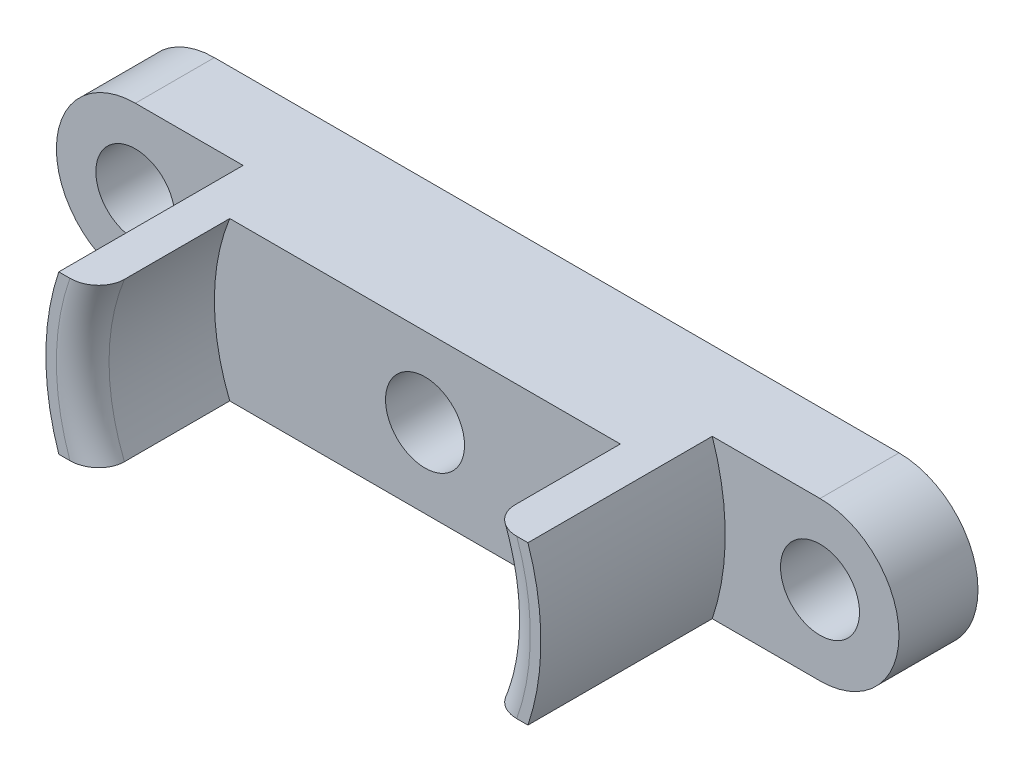
ISO-10303-21;
HEADER;
FILE_DESCRIPTION(('STEP AP214'),'2;1');
FILE_NAME('part.step','',(''),(''),'','','');
FILE_SCHEMA(('AUTOMOTIVE_DESIGN { 1 0 10303 214 1 1 1 1 }'));
ENDSEC;
DATA;
#1=APPLICATION_CONTEXT('core data for automotive mechanical design processes');
#2=APPLICATION_PROTOCOL_DEFINITION('international standard','automotive_design',2000,#1);
#3=PRODUCT_CONTEXT('',#1,'mechanical');
#4=PRODUCT('Part','Part','',(#3));
#5=PRODUCT_RELATED_PRODUCT_CATEGORY('part','',(#4));
#6=PRODUCT_DEFINITION_FORMATION('','',#4);
#7=PRODUCT_DEFINITION_CONTEXT('part definition',#1,'design');
#8=PRODUCT_DEFINITION('design','',#6,#7);
#9=PRODUCT_DEFINITION_SHAPE('','',#8);
#10=(LENGTH_UNIT() NAMED_UNIT(*) SI_UNIT(.MILLI.,.METRE.));
#11=(NAMED_UNIT(*) PLANE_ANGLE_UNIT() SI_UNIT($,.RADIAN.));
#12=(NAMED_UNIT(*) SI_UNIT($,.STERADIAN.) SOLID_ANGLE_UNIT());
#13=UNCERTAINTY_MEASURE_WITH_UNIT(LENGTH_MEASURE(1.E-05),#10,'distance_accuracy_value','');
#14=(GEOMETRIC_REPRESENTATION_CONTEXT(3) GLOBAL_UNCERTAINTY_ASSIGNED_CONTEXT((#13)) GLOBAL_UNIT_ASSIGNED_CONTEXT((#10,
#11,#12)) REPRESENTATION_CONTEXT('',''));
#15=CARTESIAN_POINT('',(0.,0.,0.));
#16=DIRECTION('',(0.,0.,1.));
#17=DIRECTION('',(1.,0.,0.));
#18=AXIS2_PLACEMENT_3D('',#15,#16,#17);
#19=CARTESIAN_POINT('',(9.4,0.,0.));
#20=DIRECTION('',(0.,0.,-1.));
#21=DIRECTION('',(-1.,0.,0.));
#22=AXIS2_PLACEMENT_3D('',#19,#20,#21);
#23=PLANE('',#22);
#24=CARTESIAN_POINT('',(0.,0.,0.));
#25=DIRECTION('',(0.,0.,1.));
#26=DIRECTION('',(1.,0.,0.));
#27=AXIS2_PLACEMENT_3D('',#24,#25,#26);
#28=CIRCLE('',#27,1.5);
#29=CARTESIAN_POINT('',(1.5,0.,0.));
#30=VERTEX_POINT('',#29);
#31=EDGE_CURVE('E193',#30,#30,#28,.T.);
#32=ORIENTED_EDGE('',*,*,#31,.F.);
#33=EDGE_LOOP('',(#32));
#34=FACE_BOUND('',#33,.T.);
#35=DIRECTION('',(1.,0.,0.));
#36=VECTOR('',#35,1.);
#37=CARTESIAN_POINT('',(9.4,-3.,0.));
#38=LINE('',#37,#36);
#39=CARTESIAN_POINT('',(-7.41619848709566,-3.,0.));
#40=VERTEX_POINT('',#39);
#41=CARTESIAN_POINT('',(7.41619848709566,-3.,0.));
#42=VERTEX_POINT('',#41);
#43=EDGE_CURVE('E246',#40,#42,#38,.T.);
#44=ORIENTED_EDGE('',*,*,#43,.T.);
#45=CARTESIAN_POINT('',(0.,0.,0.));
#46=DIRECTION('',(0.,0.,1.));
#47=DIRECTION('',(1.,0.,0.));
#48=AXIS2_PLACEMENT_3D('',#45,#46,#47);
#49=CIRCLE('',#48,8.);
#50=CARTESIAN_POINT('',(7.41619848709566,3.,0.));
#51=VERTEX_POINT('',#50);
#52=EDGE_CURVE('E148',#42,#51,#49,.T.);
#53=ORIENTED_EDGE('',*,*,#52,.T.);
#54=DIRECTION('',(1.,0.,0.));
#55=VECTOR('',#54,1.);
#56=CARTESIAN_POINT('',(9.4,3.,0.));
#57=LINE('',#56,#55);
#58=CARTESIAN_POINT('',(-7.41619848709566,3.,0.));
#59=VERTEX_POINT('',#58);
#60=EDGE_CURVE('E243',#59,#51,#57,.T.);
#61=ORIENTED_EDGE('',*,*,#60,.F.);
#62=CARTESIAN_POINT('',(0.,0.,0.));
#63=DIRECTION('',(0.,0.,1.));
#64=DIRECTION('',(1.,0.,0.));
#65=AXIS2_PLACEMENT_3D('',#62,#63,#64);
#66=CIRCLE('',#65,8.);
#67=EDGE_CURVE('E174',#59,#40,#66,.T.);
#68=ORIENTED_EDGE('',*,*,#67,.T.);
#69=EDGE_LOOP('',(#44,#53,#61,#68));
#70=FACE_BOUND('',#69,.T.);
#71=ADVANCED_FACE('F39',(#34,#70),#23,.F.);
#72=CARTESIAN_POINT('',(0.,0.,0.));
#73=DIRECTION('',(0.,0.,-1.));
#74=DIRECTION('',(-1.,0.,0.));
#75=AXIS2_PLACEMENT_3D('',#72,#73,#74);
#76=CYLINDRICAL_SURFACE('',#75,9.4);
#77=CARTESIAN_POINT('',(0.,0.,-2.));
#78=DIRECTION('',(0.,0.,-1.));
#79=DIRECTION('',(-1.,0.,0.));
#80=AXIS2_PLACEMENT_3D('',#77,#78,#79);
#81=CIRCLE('',#80,9.4);
#82=CARTESIAN_POINT('',(-8.90842298052804,-3.,-2.));
#83=VERTEX_POINT('',#82);
#84=CARTESIAN_POINT('',(-8.90842298052804,3.,-2.));
#85=VERTEX_POINT('',#84);
#86=EDGE_CURVE('E239',#83,#85,#81,.T.);
#87=ORIENTED_EDGE('',*,*,#86,.F.);
#88=DIRECTION('',(0.,0.,-1.));
#89=VECTOR('',#88,1.);
#90=CARTESIAN_POINT('',(-8.90842298052804,-3.,0.));
#91=LINE('',#90,#89);
#92=CARTESIAN_POINT('',(-8.90842298052804,-3.,5.));
#93=VERTEX_POINT('',#92);
#94=EDGE_CURVE('E227',#83,#93,#91,.F.);
#95=ORIENTED_EDGE('',*,*,#94,.T.);
#96=CARTESIAN_POINT('',(0.,0.,5.));
#97=DIRECTION('',(0.,0.,1.));
#98=DIRECTION('',(1.,0.,0.));
#99=AXIS2_PLACEMENT_3D('',#96,#97,#98);
#100=CIRCLE('',#99,9.4);
#101=CARTESIAN_POINT('',(-8.90842298052804,3.,5.));
#102=VERTEX_POINT('',#101);
#103=EDGE_CURVE('E177',#102,#93,#100,.T.);
#104=ORIENTED_EDGE('',*,*,#103,.F.);
#105=DIRECTION('',(0.,0.,-1.));
#106=VECTOR('',#105,1.);
#107=CARTESIAN_POINT('',(-8.90842298052804,3.,0.));
#108=LINE('',#107,#106);
#109=EDGE_CURVE('E211',#85,#102,#108,.F.);
#110=ORIENTED_EDGE('',*,*,#109,.F.);
#111=EDGE_LOOP('',(#87,#95,#104,#110));
#112=FACE_BOUND('',#111,.T.);
#113=ADVANCED_FACE('F314',(#112),#76,.T.);
#114=DIRECTION('',(0.,0.,-1.));
#115=VECTOR('',#114,1.);
#116=CARTESIAN_POINT('',(8.90842298052804,3.,0.));
#117=LINE('',#116,#115);
#118=CARTESIAN_POINT('',(8.90842298052804,3.,5.));
#119=VERTEX_POINT('',#118);
#120=CARTESIAN_POINT('',(8.90842298052804,3.,-2.));
#121=VERTEX_POINT('',#120);
#122=EDGE_CURVE('E163',#119,#121,#117,.T.);
#123=ORIENTED_EDGE('',*,*,#122,.F.);
#124=CARTESIAN_POINT('',(0.,0.,5.));
#125=DIRECTION('',(0.,0.,1.));
#126=DIRECTION('',(1.,0.,0.));
#127=AXIS2_PLACEMENT_3D('',#124,#125,#126);
#128=CIRCLE('',#127,9.4);
#129=CARTESIAN_POINT('',(8.90842298052804,-3.,5.));
#130=VERTEX_POINT('',#129);
#131=EDGE_CURVE('E145',#130,#119,#128,.T.);
#132=ORIENTED_EDGE('',*,*,#131,.F.);
#133=DIRECTION('',(0.,0.,-1.));
#134=VECTOR('',#133,1.);
#135=CARTESIAN_POINT('',(8.90842298052804,-3.,0.));
#136=LINE('',#135,#134);
#137=CARTESIAN_POINT('',(8.90842298052804,-3.,-2.));
#138=VERTEX_POINT('',#137);
#139=EDGE_CURVE('E151',#130,#138,#136,.T.);
#140=ORIENTED_EDGE('',*,*,#139,.T.);
#141=EDGE_CURVE('E242',#121,#138,#81,.T.);
#142=ORIENTED_EDGE('',*,*,#141,.F.);
#143=EDGE_LOOP('',(#123,#132,#140,#142));
#144=FACE_BOUND('',#143,.T.);
#145=ADVANCED_FACE('F162',(#144),#76,.T.);
#146=CARTESIAN_POINT('',(20.,0.,-2.));
#147=DIRECTION('',(0.,0.,-1.));
#148=DIRECTION('',(-1.,0.,0.));
#149=AXIS2_PLACEMENT_3D('',#146,#147,#148);
#150=PLANE('',#149);
#151=CARTESIAN_POINT('',(13.,0.,-2.));
#152=DIRECTION('',(0.,0.,-1.));
#153=DIRECTION('',(-1.,0.,0.));
#154=AXIS2_PLACEMENT_3D('',#151,#152,#153);
#155=CIRCLE('',#154,1.5);
#156=CARTESIAN_POINT('',(11.5,0.,-2.));
#157=VERTEX_POINT('',#156);
#158=EDGE_CURVE('E199',#157,#157,#155,.T.);
#159=ORIENTED_EDGE('',*,*,#158,.T.);
#160=EDGE_LOOP('',(#159));
#161=FACE_BOUND('',#160,.T.);
#162=ORIENTED_EDGE('',*,*,#141,.T.);
#163=DIRECTION('',(1.,0.,0.));
#164=VECTOR('',#163,1.);
#165=CARTESIAN_POINT('',(20.,-3.,-2.));
#166=LINE('',#165,#164);
#167=CARTESIAN_POINT('',(13.,-3.,-2.));
#168=VERTEX_POINT('',#167);
#169=EDGE_CURVE('E156',#138,#168,#166,.T.);
#170=ORIENTED_EDGE('',*,*,#169,.T.);
#171=CARTESIAN_POINT('',(13.,0.,-2.));
#172=DIRECTION('',(0.,0.,-1.));
#173=DIRECTION('',(-1.,0.,0.));
#174=AXIS2_PLACEMENT_3D('',#171,#172,#173);
#175=CIRCLE('',#174,3.);
#176=CARTESIAN_POINT('',(13.,3.,-2.));
#177=VERTEX_POINT('',#176);
#178=EDGE_CURVE('E249',#177,#168,#175,.T.);
#179=ORIENTED_EDGE('',*,*,#178,.F.);
#180=DIRECTION('',(1.,0.,0.));
#181=VECTOR('',#180,1.);
#182=CARTESIAN_POINT('',(20.,3.,-2.));
#183=LINE('',#182,#181);
#184=EDGE_CURVE('E223',#121,#177,#183,.T.);
#185=ORIENTED_EDGE('',*,*,#184,.F.);
#186=EDGE_LOOP('',(#162,#170,#179,#185));
#187=FACE_BOUND('',#186,.T.);
#188=ADVANCED_FACE('F308',(#161,#187),#150,.F.);
#189=CARTESIAN_POINT('',(-13.,0.,-2.));
#190=DIRECTION('',(0.,0.,-1.));
#191=DIRECTION('',(-1.,0.,0.));
#192=AXIS2_PLACEMENT_3D('',#189,#190,#191);
#193=CIRCLE('',#192,1.5);
#194=CARTESIAN_POINT('',(-14.5,0.,-2.));
#195=VERTEX_POINT('',#194);
#196=EDGE_CURVE('E204',#195,#195,#193,.T.);
#197=ORIENTED_EDGE('',*,*,#196,.T.);
#198=EDGE_LOOP('',(#197));
#199=FACE_BOUND('',#198,.T.);
#200=CARTESIAN_POINT('',(-13.,0.,-2.));
#201=DIRECTION('',(0.,0.,-1.));
#202=DIRECTION('',(-1.,0.,0.));
#203=AXIS2_PLACEMENT_3D('',#200,#201,#202);
#204=CIRCLE('',#203,3.);
#205=CARTESIAN_POINT('',(-13.,-3.,-2.));
#206=VERTEX_POINT('',#205);
#207=CARTESIAN_POINT('',(-13.,3.,-2.));
#208=VERTEX_POINT('',#207);
#209=EDGE_CURVE('E251',#206,#208,#204,.T.);
#210=ORIENTED_EDGE('',*,*,#209,.F.);
#211=EDGE_CURVE('E160',#206,#83,#166,.T.);
#212=ORIENTED_EDGE('',*,*,#211,.T.);
#213=ORIENTED_EDGE('',*,*,#86,.T.);
#214=EDGE_CURVE('E221',#208,#85,#183,.T.);
#215=ORIENTED_EDGE('',*,*,#214,.F.);
#216=EDGE_LOOP('',(#210,#212,#213,#215));
#217=FACE_BOUND('',#216,.T.);
#218=ADVANCED_FACE('F311',(#199,#217),#150,.F.);
#219=CARTESIAN_POINT('',(-13.,0.,-10.));
#220=DIRECTION('',(0.,0.,1.));
#221=DIRECTION('',(1.,0.,0.));
#222=AXIS2_PLACEMENT_3D('',#219,#220,#221);
#223=CYLINDRICAL_SURFACE('',#222,3.);
#224=CARTESIAN_POINT('',(-13.,0.,-5.));
#225=DIRECTION('',(0.,0.,1.));
#226=DIRECTION('',(1.,0.,0.));
#227=AXIS2_PLACEMENT_3D('',#224,#225,#226);
#228=CIRCLE('',#227,3.);
#229=CARTESIAN_POINT('',(-13.,3.,-5.));
#230=VERTEX_POINT('',#229);
#231=CARTESIAN_POINT('',(-13.,-3.,-5.));
#232=VERTEX_POINT('',#231);
#233=EDGE_CURVE('E237',#230,#232,#228,.T.);
#234=ORIENTED_EDGE('',*,*,#233,.T.);
#235=DIRECTION('',(0.,0.,1.));
#236=VECTOR('',#235,1.);
#237=CARTESIAN_POINT('',(-13.,-3.,-10.));
#238=LINE('',#237,#236);
#239=EDGE_CURVE('E208',#232,#206,#238,.T.);
#240=ORIENTED_EDGE('',*,*,#239,.T.);
#241=ORIENTED_EDGE('',*,*,#209,.T.);
#242=DIRECTION('',(0.,0.,1.));
#243=VECTOR('',#242,1.);
#244=CARTESIAN_POINT('',(-13.,3.,-10.));
#245=LINE('',#244,#243);
#246=EDGE_CURVE('E207',#230,#208,#245,.T.);
#247=ORIENTED_EDGE('',*,*,#246,.F.);
#248=EDGE_LOOP('',(#234,#240,#241,#247));
#249=FACE_BOUND('',#248,.T.);
#250=ADVANCED_FACE('F280',(#249),#223,.T.);
#251=CARTESIAN_POINT('',(13.,0.,-10.));
#252=DIRECTION('',(0.,0.,1.));
#253=DIRECTION('',(1.,0.,0.));
#254=AXIS2_PLACEMENT_3D('',#251,#252,#253);
#255=CYLINDRICAL_SURFACE('',#254,3.);
#256=CARTESIAN_POINT('',(13.,0.,-5.));
#257=DIRECTION('',(0.,0.,1.));
#258=DIRECTION('',(1.,0.,0.));
#259=AXIS2_PLACEMENT_3D('',#256,#257,#258);
#260=CIRCLE('',#259,3.);
#261=CARTESIAN_POINT('',(13.,-3.,-5.));
#262=VERTEX_POINT('',#261);
#263=CARTESIAN_POINT('',(13.,3.,-5.));
#264=VERTEX_POINT('',#263);
#265=EDGE_CURVE('E234',#262,#264,#260,.T.);
#266=ORIENTED_EDGE('',*,*,#265,.T.);
#267=DIRECTION('',(0.,0.,1.));
#268=VECTOR('',#267,1.);
#269=CARTESIAN_POINT('',(13.,3.,-10.));
#270=LINE('',#269,#268);
#271=EDGE_CURVE('E214',#264,#177,#270,.T.);
#272=ORIENTED_EDGE('',*,*,#271,.T.);
#273=ORIENTED_EDGE('',*,*,#178,.T.);
#274=DIRECTION('',(0.,0.,1.));
#275=VECTOR('',#274,1.);
#276=CARTESIAN_POINT('',(13.,-3.,-10.));
#277=LINE('',#276,#275);
#278=EDGE_CURVE('E212',#262,#168,#277,.T.);
#279=ORIENTED_EDGE('',*,*,#278,.F.);
#280=EDGE_LOOP('',(#266,#272,#273,#279));
#281=FACE_BOUND('',#280,.T.);
#282=ADVANCED_FACE('F274',(#281),#255,.T.);
#283=CARTESIAN_POINT('',(0.,-3.,-10.));
#284=DIRECTION('',(0.,1.,0.));
#285=DIRECTION('',(-1.,0.,0.));
#286=AXIS2_PLACEMENT_3D('',#283,#284,#285);
#287=PLANE('',#286);
#288=DIRECTION('',(0.,0.,-1.));
#289=VECTOR('',#288,1.);
#290=CARTESIAN_POINT('',(-7.41619848709566,-3.,5.));
#291=LINE('',#290,#289);
#292=CARTESIAN_POINT('',(-7.41619848709566,-3.,4.));
#293=VERTEX_POINT('',#292);
#294=EDGE_CURVE('E183',#293,#40,#291,.T.);
#295=ORIENTED_EDGE('',*,*,#294,.F.);
#296=CARTESIAN_POINT('',(-7.41619848709566,-3.,4.));
#297=CARTESIAN_POINT('',(-7.4161974516499,-3.,4.02671031925472));
#298=CARTESIAN_POINT('',(-7.41735370748078,-3.,4.05340720680812));
#299=CARTESIAN_POINT('',(-7.42195828462665,-3.,4.10659690853907));
#300=CARTESIAN_POINT('',(-7.42540611379944,-3.,4.13308976529908));
#301=CARTESIAN_POINT('',(-7.4391197375161,-3.,4.21181741639208));
#302=CARTESIAN_POINT('',(-7.45275605613087,-3.,4.26350321971868));
#303=CARTESIAN_POINT('',(-7.4884583472389,-3.,4.36381342367036));
#304=CARTESIAN_POINT('',(-7.51052161952716,-3.,4.41243879912516));
#305=CARTESIAN_POINT('',(-7.56225114660627,-3.,4.50547851711049));
#306=CARTESIAN_POINT('',(-7.59192080321964,-3.,4.54989096327469));
#307=CARTESIAN_POINT('',(-7.65893400910423,-3.,4.6348559352489));
#308=CARTESIAN_POINT('',(-7.6964958261191,-3.,4.67523586239732));
#309=CARTESIAN_POINT('',(-7.77747805679832,-3.,4.74961235501127));
#310=CARTESIAN_POINT('',(-7.82090018355841,-3.,4.78360704695797));
#311=CARTESIAN_POINT('',(-7.91552912228609,-3.,4.84667744181656));
#312=CARTESIAN_POINT('',(-7.96706490899262,-3.,4.8752594190202));
#313=CARTESIAN_POINT('',(-8.07401768747977,-3.,4.92389691310696));
#314=CARTESIAN_POINT('',(-8.12943533997931,-3.,4.94395097435576));
#315=CARTESIAN_POINT('',(-8.23476233559423,-3.,4.97296668075931));
#316=CARTESIAN_POINT('',(-8.28435629789409,-3.,4.9830884004965));
#317=CARTESIAN_POINT('',(-8.38439055372453,-3.,4.99660629151515));
#318=CARTESIAN_POINT('',(-8.43482974049444,-3.,5.00001065581628));
#319=CARTESIAN_POINT('',(-8.48528137423857,-3.,5.));
#320=B_SPLINE_CURVE_WITH_KNOTS('',3,(#296,#297,#298,#299,#300,#301,#302,#303,#304,#305,#306,
#307,#308,#309,#310,#311,#312,#313,#314,#315,#316,#317,#318,#319),.UNSPECIFIED.,.F.,.F.,(4,2,2,
2,2,2,2,2,2,2,2,4),(0.,0.0800795988703778,0.160142005264271,0.319669063502225,0.479145048138582,
0.638692480425243,0.803430892753028,0.968217566423583,1.144244987843,1.32030244342439,
1.47170555658374,1.62292389206545),.UNSPECIFIED.);
#321=CARTESIAN_POINT('',(-8.48528137423857,-3.,5.));
#322=VERTEX_POINT('',#321);
#323=EDGE_CURVE('E263',#293,#322,#320,.T.);
#324=ORIENTED_EDGE('',*,*,#323,.T.);
#325=DIRECTION('',(1.,0.,0.));
#326=VECTOR('',#325,1.);
#327=CARTESIAN_POINT('',(0.,-3.,5.));
#328=LINE('',#327,#326);
#329=EDGE_CURVE('E180',#93,#322,#328,.T.);
#330=ORIENTED_EDGE('',*,*,#329,.F.);
#331=ORIENTED_EDGE('',*,*,#94,.F.);
#332=ORIENTED_EDGE('',*,*,#211,.F.);
#333=ORIENTED_EDGE('',*,*,#239,.F.);
#334=DIRECTION('',(-1.,0.,0.));
#335=VECTOR('',#334,1.);
#336=CARTESIAN_POINT('',(0.,-3.,-5.));
#337=LINE('',#336,#335);
#338=EDGE_CURVE('E231',#262,#232,#337,.T.);
#339=ORIENTED_EDGE('',*,*,#338,.F.);
#340=ORIENTED_EDGE('',*,*,#278,.T.);
#341=ORIENTED_EDGE('',*,*,#169,.F.);
#342=ORIENTED_EDGE('',*,*,#139,.F.);
#343=DIRECTION('',(1.,0.,0.));
#344=VECTOR('',#343,1.);
#345=CARTESIAN_POINT('',(0.,-3.,5.));
#346=LINE('',#345,#344);
#347=CARTESIAN_POINT('',(8.48528137423857,-3.,5.));
#348=VERTEX_POINT('',#347);
#349=EDGE_CURVE('E141',#348,#130,#346,.T.);
#350=ORIENTED_EDGE('',*,*,#349,.F.);
#351=CARTESIAN_POINT('',(8.48528137423857,-3.,5.));
#352=CARTESIAN_POINT('',(8.42226393540121,-3.,5.0000319900897));
#353=CARTESIAN_POINT('',(8.35925227893192,-3.,4.99470639341083));
#354=CARTESIAN_POINT('',(8.23494281659764,-3.,4.97364389436913));
#355=CARTESIAN_POINT('',(8.17364638008231,-3.,4.95789890767096));
#356=CARTESIAN_POINT('',(8.05452747973125,-3.,4.91628651175392));
#357=CARTESIAN_POINT('',(7.99670770733442,-3.,4.89041137382055));
#358=CARTESIAN_POINT('',(7.88639312032773,-3.,4.8291071882532));
#359=CARTESIAN_POINT('',(7.83389563064259,-3.,4.79368297324682));
#360=CARTESIAN_POINT('',(7.73717380407074,-3.,4.71502801902589));
#361=CARTESIAN_POINT('',(7.69278168869515,-3.,4.67200415176985));
#362=CARTESIAN_POINT('',(7.61243799180938,-3.,4.57865017114228));
#363=CARTESIAN_POINT('',(7.57648578754844,-3.,4.52832059727638));
#364=CARTESIAN_POINT('',(7.51658187323216,-3.,4.42522415374338));
#365=CARTESIAN_POINT('',(7.49201234456019,-3.,4.3728158919755));
#366=CARTESIAN_POINT('',(7.45277650420531,-3.,4.26445470148666));
#367=CARTESIAN_POINT('',(7.43809309595684,-3.,4.20850807613736));
#368=CARTESIAN_POINT('',(7.42453409593175,-3.,4.12666659642371));
#369=CARTESIAN_POINT('',(7.42140952314321,-3.,4.10141676743156));
#370=CARTESIAN_POINT('',(7.41724337514938,-3.,4.05078258934528));
#371=CARTESIAN_POINT('',(7.41619879948655,-3.,4.02539848705991));
#372=CARTESIAN_POINT('',(7.41619848709566,-3.,4.));
#373=B_SPLINE_CURVE_WITH_KNOTS('',3,(#351,#352,#353,#354,#355,#356,#357,#358,#359,#360,#361,
#362,#363,#364,#365,#366,#367,#368,#369,#370,#371,#372),.UNSPECIFIED.,.F.,.F.,(4,2,2,2,2,2,2,2,
2,2,4),(0.,0.188823641078102,0.377793961207349,0.5669087365114,0.755927983104457,
0.9404284487611,1.12491529650832,1.29766847240514,1.47012212487818,1.54637780906175,
1.62252341223943),.UNSPECIFIED.);
#374=CARTESIAN_POINT('',(7.41619848709566,-3.,4.));
#375=VERTEX_POINT('',#374);
#376=EDGE_CURVE('E256',#348,#375,#373,.T.);
#377=ORIENTED_EDGE('',*,*,#376,.T.);
#378=DIRECTION('',(0.,0.,-1.));
#379=VECTOR('',#378,1.);
#380=CARTESIAN_POINT('',(7.41619848709566,-3.,5.));
#381=LINE('',#380,#379);
#382=EDGE_CURVE('E172',#375,#42,#381,.T.);
#383=ORIENTED_EDGE('',*,*,#382,.T.);
#384=ORIENTED_EDGE('',*,*,#43,.F.);
#385=EDGE_LOOP('',(#295,#324,#330,#331,#332,#333,#339,#340,#341,#342,#350,#377,#383,#384));
#386=FACE_BOUND('',#385,.T.);
#387=ADVANCED_FACE('F153',(#386),#287,.F.);
#388=CARTESIAN_POINT('',(0.,3.,-10.));
#389=DIRECTION('',(0.,1.,0.));
#390=DIRECTION('',(-1.,0.,0.));
#391=AXIS2_PLACEMENT_3D('',#388,#389,#390);
#392=PLANE('',#391);
#393=DIRECTION('',(-1.,0.,0.));
#394=VECTOR('',#393,1.);
#395=CARTESIAN_POINT('',(0.,3.,5.));
#396=LINE('',#395,#394);
#397=CARTESIAN_POINT('',(-8.48528137423857,3.,5.));
#398=VERTEX_POINT('',#397);
#399=EDGE_CURVE('E175',#398,#102,#396,.T.);
#400=ORIENTED_EDGE('',*,*,#399,.F.);
#401=CARTESIAN_POINT('',(-8.48528137423857,3.,5.));
#402=CARTESIAN_POINT('',(-8.42226393540121,3.,5.0000319900897));
#403=CARTESIAN_POINT('',(-8.35925227893192,3.,4.99470639341083));
#404=CARTESIAN_POINT('',(-8.23494281659764,3.,4.97364389436913));
#405=CARTESIAN_POINT('',(-8.17364638008231,3.,4.95789890767096));
#406=CARTESIAN_POINT('',(-8.05452747973125,3.,4.91628651175392));
#407=CARTESIAN_POINT('',(-7.99670770733442,3.,4.89041137382055));
#408=CARTESIAN_POINT('',(-7.88639312032773,3.,4.8291071882532));
#409=CARTESIAN_POINT('',(-7.83389563064259,3.,4.79368297324682));
#410=CARTESIAN_POINT('',(-7.73717380407074,3.,4.71502801902588));
#411=CARTESIAN_POINT('',(-7.69278168869515,3.,4.67200415176985));
#412=CARTESIAN_POINT('',(-7.61243799180938,3.,4.57865017114228));
#413=CARTESIAN_POINT('',(-7.57648578754843,3.,4.52832059727638));
#414=CARTESIAN_POINT('',(-7.51658187323215,3.,4.42522415374338));
#415=CARTESIAN_POINT('',(-7.49201234456019,3.,4.3728158919755));
#416=CARTESIAN_POINT('',(-7.45277650420531,3.,4.26445470148666));
#417=CARTESIAN_POINT('',(-7.43809309595683,3.,4.20850807613736));
#418=CARTESIAN_POINT('',(-7.42453409593175,3.,4.12666659642371));
#419=CARTESIAN_POINT('',(-7.42140952314321,3.,4.10141676743156));
#420=CARTESIAN_POINT('',(-7.41724337514938,3.,4.05078258934528));
#421=CARTESIAN_POINT('',(-7.41619879948655,3.,4.02539848705991));
#422=CARTESIAN_POINT('',(-7.41619848709566,3.,4.));
#423=B_SPLINE_CURVE_WITH_KNOTS('',3,(#401,#402,#403,#404,#405,#406,#407,#408,#409,#410,#411,
#412,#413,#414,#415,#416,#417,#418,#419,#420,#421,#422),.UNSPECIFIED.,.F.,.F.,(4,2,2,2,2,2,2,2,
2,2,4),(0.,0.188823641078102,0.377793961207349,0.566908736511398,0.755927983104456,
0.9404284487611,1.12491529650832,1.29766847240514,1.47012212487818,1.54637780906175,
1.62252341223943),.UNSPECIFIED.);
#424=CARTESIAN_POINT('',(-7.41619848709566,3.,4.));
#425=VERTEX_POINT('',#424);
#426=EDGE_CURVE('E294',#398,#425,#423,.T.);
#427=ORIENTED_EDGE('',*,*,#426,.T.);
#428=DIRECTION('',(0.,0.,-1.));
#429=VECTOR('',#428,1.);
#430=CARTESIAN_POINT('',(-7.41619848709566,3.,5.));
#431=LINE('',#430,#429);
#432=EDGE_CURVE('E187',#425,#59,#431,.T.);
#433=ORIENTED_EDGE('',*,*,#432,.T.);
#434=ORIENTED_EDGE('',*,*,#60,.T.);
#435=DIRECTION('',(0.,0.,-1.));
#436=VECTOR('',#435,1.);
#437=CARTESIAN_POINT('',(7.41619848709566,3.,5.));
#438=LINE('',#437,#436);
#439=CARTESIAN_POINT('',(7.41619848709566,3.,4.));
#440=VERTEX_POINT('',#439);
#441=EDGE_CURVE('E166',#440,#51,#438,.T.);
#442=ORIENTED_EDGE('',*,*,#441,.F.);
#443=CARTESIAN_POINT('',(7.41619848709566,3.,4.));
#444=CARTESIAN_POINT('',(7.4161974516499,3.,4.02671031925472));
#445=CARTESIAN_POINT('',(7.41735370748078,3.,4.05340720680812));
#446=CARTESIAN_POINT('',(7.42195828462665,3.,4.10659690853907));
#447=CARTESIAN_POINT('',(7.42540611379944,3.,4.13308976529908));
#448=CARTESIAN_POINT('',(7.4391197375161,3.,4.21181741639208));
#449=CARTESIAN_POINT('',(7.45275605613087,3.,4.26350321971868));
#450=CARTESIAN_POINT('',(7.4884583472389,3.,4.36381342367036));
#451=CARTESIAN_POINT('',(7.51052161952716,3.,4.41243879912516));
#452=CARTESIAN_POINT('',(7.56225114660626,3.,4.50547851711049));
#453=CARTESIAN_POINT('',(7.59192080321964,3.,4.54989096327469));
#454=CARTESIAN_POINT('',(7.65893400910423,3.,4.6348559352489));
#455=CARTESIAN_POINT('',(7.6964958261191,3.,4.67523586239732));
#456=CARTESIAN_POINT('',(7.77747805679832,3.,4.74961235501127));
#457=CARTESIAN_POINT('',(7.82090018355841,3.,4.78360704695797));
#458=CARTESIAN_POINT('',(7.91552912228609,3.,4.84667744181656));
#459=CARTESIAN_POINT('',(7.96706490899262,3.,4.8752594190202));
#460=CARTESIAN_POINT('',(8.07401768747977,3.,4.92389691310696));
#461=CARTESIAN_POINT('',(8.12943533997931,3.,4.94395097435576));
#462=CARTESIAN_POINT('',(8.23476233559423,3.,4.97296668075931));
#463=CARTESIAN_POINT('',(8.28435629789409,3.,4.9830884004965));
#464=CARTESIAN_POINT('',(8.38439055372453,3.,4.99660629151515));
#465=CARTESIAN_POINT('',(8.43482974049444,3.,5.00001065581628));
#466=CARTESIAN_POINT('',(8.48528137423857,3.,5.));
#467=B_SPLINE_CURVE_WITH_KNOTS('',3,(#443,#444,#445,#446,#447,#448,#449,#450,#451,#452,#453,
#454,#455,#456,#457,#458,#459,#460,#461,#462,#463,#464,#465,#466),.UNSPECIFIED.,.F.,.F.,(4,2,2,
2,2,2,2,2,2,2,2,4),(0.,0.0800795988703779,0.160142005264271,0.319669063502225,0.479145048138582,
0.638692480425243,0.803430892753028,0.968217566423582,1.144244987843,1.32030244342439,
1.47170555658374,1.62292389206545),.UNSPECIFIED.);
#468=CARTESIAN_POINT('',(8.48528137423857,3.,5.));
#469=VERTEX_POINT('',#468);
#470=EDGE_CURVE('E55',#440,#469,#467,.T.);
#471=ORIENTED_EDGE('',*,*,#470,.T.);
#472=DIRECTION('',(-1.,0.,0.));
#473=VECTOR('',#472,1.);
#474=CARTESIAN_POINT('',(0.,3.,5.));
#475=LINE('',#474,#473);
#476=EDGE_CURVE('E164',#119,#469,#475,.T.);
#477=ORIENTED_EDGE('',*,*,#476,.F.);
#478=ORIENTED_EDGE('',*,*,#122,.T.);
#479=ORIENTED_EDGE('',*,*,#184,.T.);
#480=ORIENTED_EDGE('',*,*,#271,.F.);
#481=DIRECTION('',(-1.,0.,0.));
#482=VECTOR('',#481,1.);
#483=CARTESIAN_POINT('',(0.,3.,-5.));
#484=LINE('',#483,#482);
#485=EDGE_CURVE('E225',#264,#230,#484,.T.);
#486=ORIENTED_EDGE('',*,*,#485,.T.);
#487=ORIENTED_EDGE('',*,*,#246,.T.);
#488=ORIENTED_EDGE('',*,*,#214,.T.);
#489=ORIENTED_EDGE('',*,*,#109,.T.);
#490=EDGE_LOOP('',(#400,#427,#433,#434,#442,#471,#477,#478,#479,#480,#486,#487,#488,#489));
#491=FACE_BOUND('',#490,.T.);
#492=ADVANCED_FACE('F273',(#491),#392,.T.);
#493=CARTESIAN_POINT('',(0.,0.,-5.));
#494=DIRECTION('',(0.,0.,1.));
#495=DIRECTION('',(1.,0.,0.));
#496=AXIS2_PLACEMENT_3D('',#493,#494,#495);
#497=PLANE('',#496);
#498=CARTESIAN_POINT('',(-13.,0.,-5.));
#499=DIRECTION('',(0.,0.,1.));
#500=DIRECTION('',(1.,0.,0.));
#501=AXIS2_PLACEMENT_3D('',#498,#499,#500);
#502=CIRCLE('',#501,1.5);
#503=CARTESIAN_POINT('',(-11.5,0.,-5.));
#504=VERTEX_POINT('',#503);
#505=EDGE_CURVE('E189',#504,#504,#502,.T.);
#506=ORIENTED_EDGE('',*,*,#505,.T.);
#507=EDGE_LOOP('',(#506));
#508=FACE_BOUND('',#507,.T.);
#509=CARTESIAN_POINT('',(13.,0.,-5.));
#510=DIRECTION('',(0.,0.,1.));
#511=DIRECTION('',(1.,0.,0.));
#512=AXIS2_PLACEMENT_3D('',#509,#510,#511);
#513=CIRCLE('',#512,1.5);
#514=CARTESIAN_POINT('',(14.5,0.,-5.));
#515=VERTEX_POINT('',#514);
#516=EDGE_CURVE('E190',#515,#515,#513,.T.);
#517=ORIENTED_EDGE('',*,*,#516,.T.);
#518=EDGE_LOOP('',(#517));
#519=FACE_BOUND('',#518,.T.);
#520=CARTESIAN_POINT('',(0.,0.,-5.));
#521=DIRECTION('',(0.,0.,1.));
#522=DIRECTION('',(1.,0.,0.));
#523=AXIS2_PLACEMENT_3D('',#520,#521,#522);
#524=CIRCLE('',#523,1.5);
#525=CARTESIAN_POINT('',(1.5,0.,-5.));
#526=VERTEX_POINT('',#525);
#527=EDGE_CURVE('E196',#526,#526,#524,.T.);
#528=ORIENTED_EDGE('',*,*,#527,.T.);
#529=EDGE_LOOP('',(#528));
#530=FACE_BOUND('',#529,.T.);
#531=ORIENTED_EDGE('',*,*,#233,.F.);
#532=ORIENTED_EDGE('',*,*,#485,.F.);
#533=ORIENTED_EDGE('',*,*,#265,.F.);
#534=ORIENTED_EDGE('',*,*,#338,.T.);
#535=EDGE_LOOP('',(#531,#532,#533,#534));
#536=FACE_BOUND('',#535,.T.);
#537=ADVANCED_FACE('F285',(#508,#519,#530,#536),#497,.F.);
#538=CARTESIAN_POINT('',(0.,0.,-5.));
#539=DIRECTION('',(0.,0.,1.));
#540=DIRECTION('',(1.,0.,0.));
#541=AXIS2_PLACEMENT_3D('',#538,#539,#540);
#542=CYLINDRICAL_SURFACE('',#541,1.5);
#543=ORIENTED_EDGE('',*,*,#527,.F.);
#544=EDGE_LOOP('',(#543));
#545=FACE_BOUND('',#544,.T.);
#546=ORIENTED_EDGE('',*,*,#31,.T.);
#547=EDGE_LOOP('',(#546));
#548=FACE_BOUND('',#547,.T.);
#549=ADVANCED_FACE('F275',(#545,#548),#542,.F.);
#550=CARTESIAN_POINT('',(13.,0.,-5.));
#551=DIRECTION('',(0.,0.,1.));
#552=DIRECTION('',(1.,0.,0.));
#553=AXIS2_PLACEMENT_3D('',#550,#551,#552);
#554=CYLINDRICAL_SURFACE('',#553,1.5);
#555=ORIENTED_EDGE('',*,*,#516,.F.);
#556=EDGE_LOOP('',(#555));
#557=FACE_BOUND('',#556,.T.);
#558=ORIENTED_EDGE('',*,*,#158,.F.);
#559=EDGE_LOOP('',(#558));
#560=FACE_BOUND('',#559,.T.);
#561=ADVANCED_FACE('F397',(#557,#560),#554,.F.);
#562=CARTESIAN_POINT('',(-13.,0.,-5.));
#563=DIRECTION('',(0.,0.,1.));
#564=DIRECTION('',(1.,0.,0.));
#565=AXIS2_PLACEMENT_3D('',#562,#563,#564);
#566=CYLINDRICAL_SURFACE('',#565,1.5);
#567=ORIENTED_EDGE('',*,*,#505,.F.);
#568=EDGE_LOOP('',(#567));
#569=FACE_BOUND('',#568,.T.);
#570=ORIENTED_EDGE('',*,*,#196,.F.);
#571=EDGE_LOOP('',(#570));
#572=FACE_BOUND('',#571,.T.);
#573=ADVANCED_FACE('F389',(#569,#572),#566,.F.);
#574=CARTESIAN_POINT('',(0.,0.,5.));
#575=DIRECTION('',(0.,0.,-1.));
#576=DIRECTION('',(-1.,0.,0.));
#577=AXIS2_PLACEMENT_3D('',#574,#575,#576);
#578=CYLINDRICAL_SURFACE('',#577,8.);
#579=ORIENTED_EDGE('',*,*,#432,.F.);
#580=CARTESIAN_POINT('',(0.,0.,4.));
#581=DIRECTION('',(0.,0.,1.));
#582=DIRECTION('',(1.,0.,0.));
#583=AXIS2_PLACEMENT_3D('',#580,#581,#582);
#584=CIRCLE('',#583,8.);
#585=EDGE_CURVE('E253',#425,#293,#584,.T.);
#586=ORIENTED_EDGE('',*,*,#585,.T.);
#587=ORIENTED_EDGE('',*,*,#294,.T.);
#588=ORIENTED_EDGE('',*,*,#67,.F.);
#589=EDGE_LOOP('',(#579,#586,#587,#588));
#590=FACE_BOUND('',#589,.T.);
#591=ADVANCED_FACE('F335',(#590),#578,.F.);
#592=CARTESIAN_POINT('',(0.,0.,5.));
#593=DIRECTION('',(0.,0.,1.));
#594=DIRECTION('',(1.,0.,0.));
#595=AXIS2_PLACEMENT_3D('',#592,#593,#594);
#596=PLANE('',#595);
#597=ORIENTED_EDGE('',*,*,#329,.T.);
#598=CARTESIAN_POINT('',(0.,0.,5.));
#599=DIRECTION('',(0.,0.,1.));
#600=DIRECTION('',(1.,0.,0.));
#601=AXIS2_PLACEMENT_3D('',#598,#599,#600);
#602=CIRCLE('',#601,9.);
#603=EDGE_CURVE('E337',#322,#398,#602,.F.);
#604=ORIENTED_EDGE('',*,*,#603,.T.);
#605=ORIENTED_EDGE('',*,*,#399,.T.);
#606=ORIENTED_EDGE('',*,*,#103,.T.);
#607=EDGE_LOOP('',(#597,#604,#605,#606));
#608=FACE_BOUND('',#607,.T.);
#609=ADVANCED_FACE('F340',(#608),#596,.T.);
#610=CARTESIAN_POINT('',(0.,0.,5.));
#611=DIRECTION('',(0.,0.,-1.));
#612=DIRECTION('',(-1.,0.,0.));
#613=AXIS2_PLACEMENT_3D('',#610,#611,#612);
#614=CYLINDRICAL_SURFACE('',#613,8.);
#615=ORIENTED_EDGE('',*,*,#382,.F.);
#616=CARTESIAN_POINT('',(0.,0.,4.));
#617=DIRECTION('',(0.,0.,1.));
#618=DIRECTION('',(1.,0.,0.));
#619=AXIS2_PLACEMENT_3D('',#616,#617,#618);
#620=CIRCLE('',#619,8.);
#621=EDGE_CURVE('E48',#375,#440,#620,.T.);
#622=ORIENTED_EDGE('',*,*,#621,.T.);
#623=ORIENTED_EDGE('',*,*,#441,.T.);
#624=ORIENTED_EDGE('',*,*,#52,.F.);
#625=EDGE_LOOP('',(#615,#622,#623,#624));
#626=FACE_BOUND('',#625,.T.);
#627=ADVANCED_FACE('F329',(#626),#614,.F.);
#628=CARTESIAN_POINT('',(0.,0.,5.));
#629=DIRECTION('',(0.,0.,1.));
#630=DIRECTION('',(1.,0.,0.));
#631=AXIS2_PLACEMENT_3D('',#628,#629,#630);
#632=PLANE('',#631);
#633=ORIENTED_EDGE('',*,*,#476,.T.);
#634=CARTESIAN_POINT('',(0.,0.,5.));
#635=DIRECTION('',(0.,0.,1.));
#636=DIRECTION('',(1.,0.,0.));
#637=AXIS2_PLACEMENT_3D('',#634,#635,#636);
#638=CIRCLE('',#637,9.);
#639=EDGE_CURVE('E11',#469,#348,#638,.F.);
#640=ORIENTED_EDGE('',*,*,#639,.T.);
#641=ORIENTED_EDGE('',*,*,#349,.T.);
#642=ORIENTED_EDGE('',*,*,#131,.T.);
#643=EDGE_LOOP('',(#633,#640,#641,#642));
#644=FACE_BOUND('',#643,.T.);
#645=ADVANCED_FACE('F143',(#644),#632,.T.);
#646=CARTESIAN_POINT('',(0.,0.,4.));
#647=DIRECTION('',(0.,0.,1.));
#648=DIRECTION('',(1.,0.,0.));
#649=AXIS2_PLACEMENT_3D('',#646,#647,#648);
#650=TOROIDAL_SURFACE('',#649,9.,1.);
#651=ORIENTED_EDGE('',*,*,#426,.F.);
#652=ORIENTED_EDGE('',*,*,#603,.F.);
#653=ORIENTED_EDGE('',*,*,#323,.F.);
#654=ORIENTED_EDGE('',*,*,#585,.F.);
#655=EDGE_LOOP('',(#651,#652,#653,#654));
#656=FACE_BOUND('',#655,.T.);
#657=ADVANCED_FACE('F299',(#656),#650,.T.);
#658=CARTESIAN_POINT('',(0.,0.,4.));
#659=DIRECTION('',(0.,0.,1.));
#660=DIRECTION('',(1.,0.,0.));
#661=AXIS2_PLACEMENT_3D('',#658,#659,#660);
#662=TOROIDAL_SURFACE('',#661,9.,1.);
#663=ORIENTED_EDGE('',*,*,#376,.F.);
#664=ORIENTED_EDGE('',*,*,#639,.F.);
#665=ORIENTED_EDGE('',*,*,#470,.F.);
#666=ORIENTED_EDGE('',*,*,#621,.F.);
#667=EDGE_LOOP('',(#663,#664,#665,#666));
#668=FACE_BOUND('',#667,.T.);
#669=ADVANCED_FACE('F41',(#668),#662,.T.);
#670=CLOSED_SHELL('',(#71,#113,#145,#188,#218,#250,#282,#387,#492,#537,#549,#561,#573,#591,#609,
#627,#645,#657,#669));
#671=MANIFOLD_SOLID_BREP('B2',#670);
#672=ADVANCED_BREP_SHAPE_REPRESENTATION('',(#18,#671),#14);
#673=SHAPE_DEFINITION_REPRESENTATION(#9,#672);
ENDSEC;
END-ISO-10303-21;
